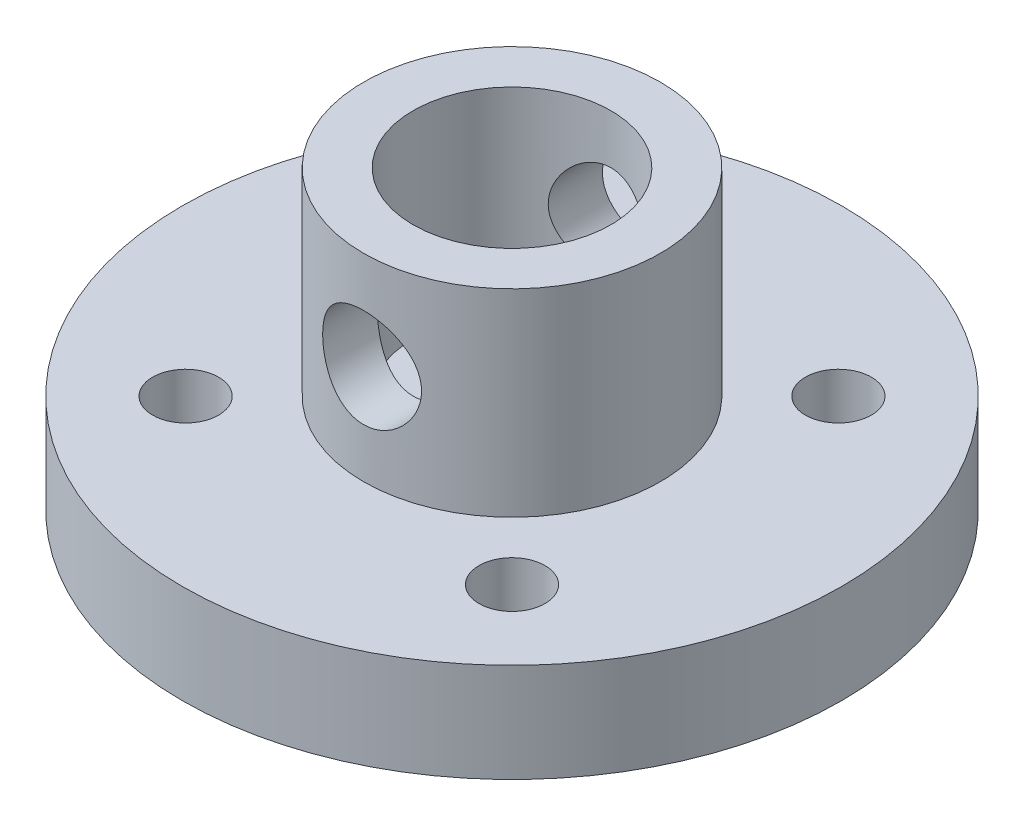
ISO-10303-21;
HEADER;
FILE_DESCRIPTION(('STEP AP214'),'2;1');
FILE_NAME('part.step','',(''),(''),'','','');
FILE_SCHEMA(('AUTOMOTIVE_DESIGN { 1 0 10303 214 1 1 1 1 }'));
ENDSEC;
DATA;
#1=APPLICATION_CONTEXT('core data for automotive mechanical design processes');
#2=APPLICATION_PROTOCOL_DEFINITION('international standard','automotive_design',2000,#1);
#3=PRODUCT_CONTEXT('',#1,'mechanical');
#4=PRODUCT('Part','Part','',(#3));
#5=PRODUCT_RELATED_PRODUCT_CATEGORY('part','',(#4));
#6=PRODUCT_DEFINITION_FORMATION('','',#4);
#7=PRODUCT_DEFINITION_CONTEXT('part definition',#1,'design');
#8=PRODUCT_DEFINITION('design','',#6,#7);
#9=PRODUCT_DEFINITION_SHAPE('','',#8);
#10=(LENGTH_UNIT() NAMED_UNIT(*) SI_UNIT(.MILLI.,.METRE.));
#11=(NAMED_UNIT(*) PLANE_ANGLE_UNIT() SI_UNIT($,.RADIAN.));
#12=(NAMED_UNIT(*) SI_UNIT($,.STERADIAN.) SOLID_ANGLE_UNIT());
#13=UNCERTAINTY_MEASURE_WITH_UNIT(LENGTH_MEASURE(1.E-05),#10,'distance_accuracy_value','');
#14=(GEOMETRIC_REPRESENTATION_CONTEXT(3) GLOBAL_UNCERTAINTY_ASSIGNED_CONTEXT((#13)) GLOBAL_UNIT_ASSIGNED_CONTEXT((#10,
#11,#12)) REPRESENTATION_CONTEXT('',''));
#15=CARTESIAN_POINT('',(0.,0.,0.));
#16=DIRECTION('',(0.,0.,1.));
#17=DIRECTION('',(1.,0.,0.));
#18=AXIS2_PLACEMENT_3D('',#15,#16,#17);
#19=CARTESIAN_POINT('',(-4.94974746830584,3.,-4.94974746830582));
#20=DIRECTION('',(0.,-1.,0.));
#21=DIRECTION('',(0.,0.,-1.));
#22=AXIS2_PLACEMENT_3D('',#19,#20,#21);
#23=CYLINDRICAL_SURFACE('',#22,1.);
#24=CARTESIAN_POINT('',(-4.94974746830584,3.,-4.94974746830582));
#25=DIRECTION('',(0.,1.,0.));
#26=DIRECTION('',(0.,0.,1.));
#27=AXIS2_PLACEMENT_3D('',#24,#25,#26);
#28=CIRCLE('',#27,1.);
#29=CARTESIAN_POINT('',(-4.94974746830584,3.,-3.94974746830582));
#30=VERTEX_POINT('',#29);
#31=EDGE_CURVE('E66',#30,#30,#28,.T.);
#32=ORIENTED_EDGE('',*,*,#31,.T.);
#33=EDGE_LOOP('',(#32));
#34=FACE_BOUND('',#33,.T.);
#35=CARTESIAN_POINT('',(-4.94974746830584,0.,-4.94974746830582));
#36=DIRECTION('',(0.,1.,0.));
#37=DIRECTION('',(0.,0.,1.));
#38=AXIS2_PLACEMENT_3D('',#35,#36,#37);
#39=CIRCLE('',#38,1.);
#40=CARTESIAN_POINT('',(-4.94974746830584,0.,-3.94974746830582));
#41=VERTEX_POINT('',#40);
#42=EDGE_CURVE('E102',#41,#41,#39,.T.);
#43=ORIENTED_EDGE('',*,*,#42,.F.);
#44=EDGE_LOOP('',(#43));
#45=FACE_BOUND('',#44,.T.);
#46=ADVANCED_FACE('F49',(#34,#45),#23,.F.);
#47=CARTESIAN_POINT('',(4.94974746830584,3.,-4.94974746830581));
#48=DIRECTION('',(0.,-1.,0.));
#49=DIRECTION('',(0.,0.,-1.));
#50=AXIS2_PLACEMENT_3D('',#47,#48,#49);
#51=CYLINDRICAL_SURFACE('',#50,1.);
#52=CARTESIAN_POINT('',(4.94974746830584,3.,-4.94974746830581));
#53=DIRECTION('',(0.,1.,0.));
#54=DIRECTION('',(0.,0.,1.));
#55=AXIS2_PLACEMENT_3D('',#52,#53,#54);
#56=CIRCLE('',#55,1.);
#57=CARTESIAN_POINT('',(4.94974746830584,3.,-3.94974746830581));
#58=VERTEX_POINT('',#57);
#59=EDGE_CURVE('E81',#58,#58,#56,.T.);
#60=ORIENTED_EDGE('',*,*,#59,.T.);
#61=EDGE_LOOP('',(#60));
#62=FACE_BOUND('',#61,.T.);
#63=CARTESIAN_POINT('',(4.94974746830584,0.,-4.94974746830581));
#64=DIRECTION('',(0.,1.,0.));
#65=DIRECTION('',(0.,0.,1.));
#66=AXIS2_PLACEMENT_3D('',#63,#64,#65);
#67=CIRCLE('',#66,1.);
#68=CARTESIAN_POINT('',(4.94974746830584,0.,-3.94974746830581));
#69=VERTEX_POINT('',#68);
#70=EDGE_CURVE('E99',#69,#69,#67,.T.);
#71=ORIENTED_EDGE('',*,*,#70,.F.);
#72=EDGE_LOOP('',(#71));
#73=FACE_BOUND('',#72,.T.);
#74=ADVANCED_FACE('F162',(#62,#73),#51,.F.);
#75=CARTESIAN_POINT('',(4.94974746830582,3.,4.94974746830587));
#76=DIRECTION('',(0.,-1.,0.));
#77=DIRECTION('',(0.,0.,-1.));
#78=AXIS2_PLACEMENT_3D('',#75,#76,#77);
#79=CYLINDRICAL_SURFACE('',#78,1.);
#80=CARTESIAN_POINT('',(4.94974746830582,3.,4.94974746830587));
#81=DIRECTION('',(0.,1.,0.));
#82=DIRECTION('',(0.,0.,1.));
#83=AXIS2_PLACEMENT_3D('',#80,#81,#82);
#84=CIRCLE('',#83,1.);
#85=CARTESIAN_POINT('',(4.94974746830582,3.,5.94974746830587));
#86=VERTEX_POINT('',#85);
#87=EDGE_CURVE('E76',#86,#86,#84,.T.);
#88=ORIENTED_EDGE('',*,*,#87,.T.);
#89=EDGE_LOOP('',(#88));
#90=FACE_BOUND('',#89,.T.);
#91=CARTESIAN_POINT('',(4.94974746830582,0.,4.94974746830587));
#92=DIRECTION('',(0.,1.,0.));
#93=DIRECTION('',(0.,0.,1.));
#94=AXIS2_PLACEMENT_3D('',#91,#92,#93);
#95=CIRCLE('',#94,1.);
#96=CARTESIAN_POINT('',(4.94974746830582,0.,5.94974746830587));
#97=VERTEX_POINT('',#96);
#98=EDGE_CURVE('E96',#97,#97,#95,.T.);
#99=ORIENTED_EDGE('',*,*,#98,.F.);
#100=EDGE_LOOP('',(#99));
#101=FACE_BOUND('',#100,.T.);
#102=ADVANCED_FACE('F167',(#90,#101),#79,.F.);
#103=CARTESIAN_POINT('',(-4.94974746830585,3.,4.94974746830587));
#104=DIRECTION('',(0.,-1.,0.));
#105=DIRECTION('',(0.,0.,-1.));
#106=AXIS2_PLACEMENT_3D('',#103,#104,#105);
#107=CYLINDRICAL_SURFACE('',#106,1.);
#108=CARTESIAN_POINT('',(-4.94974746830585,3.,4.94974746830587));
#109=DIRECTION('',(0.,1.,0.));
#110=DIRECTION('',(0.,0.,1.));
#111=AXIS2_PLACEMENT_3D('',#108,#109,#110);
#112=CIRCLE('',#111,1.);
#113=CARTESIAN_POINT('',(-4.94974746830585,3.,5.94974746830587));
#114=VERTEX_POINT('',#113);
#115=EDGE_CURVE('E77',#114,#114,#112,.T.);
#116=ORIENTED_EDGE('',*,*,#115,.T.);
#117=EDGE_LOOP('',(#116));
#118=FACE_BOUND('',#117,.T.);
#119=CARTESIAN_POINT('',(-4.94974746830585,0.,4.94974746830587));
#120=DIRECTION('',(0.,1.,0.));
#121=DIRECTION('',(0.,0.,1.));
#122=AXIS2_PLACEMENT_3D('',#119,#120,#121);
#123=CIRCLE('',#122,1.);
#124=CARTESIAN_POINT('',(-4.94974746830585,0.,5.94974746830587));
#125=VERTEX_POINT('',#124);
#126=EDGE_CURVE('E95',#125,#125,#123,.T.);
#127=ORIENTED_EDGE('',*,*,#126,.F.);
#128=EDGE_LOOP('',(#127));
#129=FACE_BOUND('',#128,.T.);
#130=ADVANCED_FACE('F55',(#118,#129),#107,.F.);
#131=CARTESIAN_POINT('',(0.,3.,0.));
#132=DIRECTION('',(0.,-1.,0.));
#133=DIRECTION('',(0.,0.,-1.));
#134=AXIS2_PLACEMENT_3D('',#131,#132,#133);
#135=CYLINDRICAL_SURFACE('',#134,10.);
#136=CARTESIAN_POINT('',(0.,3.,0.));
#137=DIRECTION('',(0.,1.,0.));
#138=DIRECTION('',(0.,0.,1.));
#139=AXIS2_PLACEMENT_3D('',#136,#137,#138);
#140=CIRCLE('',#139,10.);
#141=CARTESIAN_POINT('',(0.,3.,10.));
#142=VERTEX_POINT('',#141);
#143=EDGE_CURVE('E64',#142,#142,#140,.T.);
#144=ORIENTED_EDGE('',*,*,#143,.F.);
#145=EDGE_LOOP('',(#144));
#146=FACE_BOUND('',#145,.T.);
#147=CARTESIAN_POINT('',(0.,0.,0.));
#148=DIRECTION('',(0.,1.,0.));
#149=DIRECTION('',(0.,0.,1.));
#150=AXIS2_PLACEMENT_3D('',#147,#148,#149);
#151=CIRCLE('',#150,10.);
#152=CARTESIAN_POINT('',(0.,0.,10.));
#153=VERTEX_POINT('',#152);
#154=EDGE_CURVE('E82',#153,#153,#151,.T.);
#155=ORIENTED_EDGE('',*,*,#154,.T.);
#156=EDGE_LOOP('',(#155));
#157=FACE_BOUND('',#156,.T.);
#158=ADVANCED_FACE('F155',(#146,#157),#135,.T.);
#159=CARTESIAN_POINT('',(0.,3.,0.));
#160=DIRECTION('',(0.,1.,0.));
#161=DIRECTION('',(0.,0.,1.));
#162=AXIS2_PLACEMENT_3D('',#159,#160,#161);
#163=PLANE('',#162);
#164=CARTESIAN_POINT('',(0.,3.,0.));
#165=DIRECTION('',(0.,1.,0.));
#166=DIRECTION('',(0.,0.,1.));
#167=AXIS2_PLACEMENT_3D('',#164,#165,#166);
#168=CIRCLE('',#167,4.5);
#169=CARTESIAN_POINT('',(0.,3.,4.5));
#170=VERTEX_POINT('',#169);
#171=EDGE_CURVE('E11',#170,#170,#168,.T.);
#172=ORIENTED_EDGE('',*,*,#171,.F.);
#173=EDGE_LOOP('',(#172));
#174=FACE_BOUND('',#173,.T.);
#175=ORIENTED_EDGE('',*,*,#115,.F.);
#176=EDGE_LOOP('',(#175));
#177=FACE_BOUND('',#176,.T.);
#178=ORIENTED_EDGE('',*,*,#87,.F.);
#179=EDGE_LOOP('',(#178));
#180=FACE_BOUND('',#179,.T.);
#181=ORIENTED_EDGE('',*,*,#59,.F.);
#182=EDGE_LOOP('',(#181));
#183=FACE_BOUND('',#182,.T.);
#184=ORIENTED_EDGE('',*,*,#31,.F.);
#185=EDGE_LOOP('',(#184));
#186=FACE_BOUND('',#185,.T.);
#187=ORIENTED_EDGE('',*,*,#143,.T.);
#188=EDGE_LOOP('',(#187));
#189=FACE_BOUND('',#188,.T.);
#190=ADVANCED_FACE('F150',(#174,#177,#180,#183,#186,#189),#163,.T.);
#191=CARTESIAN_POINT('',(0.,0.,0.));
#192=DIRECTION('',(0.,1.,0.));
#193=DIRECTION('',(0.,0.,1.));
#194=AXIS2_PLACEMENT_3D('',#191,#192,#193);
#195=PLANE('',#194);
#196=ORIENTED_EDGE('',*,*,#126,.T.);
#197=EDGE_LOOP('',(#196));
#198=FACE_BOUND('',#197,.T.);
#199=ORIENTED_EDGE('',*,*,#98,.T.);
#200=EDGE_LOOP('',(#199));
#201=FACE_BOUND('',#200,.T.);
#202=ORIENTED_EDGE('',*,*,#70,.T.);
#203=EDGE_LOOP('',(#202));
#204=FACE_BOUND('',#203,.T.);
#205=ORIENTED_EDGE('',*,*,#42,.T.);
#206=EDGE_LOOP('',(#205));
#207=FACE_BOUND('',#206,.T.);
#208=ORIENTED_EDGE('',*,*,#154,.F.);
#209=EDGE_LOOP('',(#208));
#210=FACE_BOUND('',#209,.T.);
#211=ADVANCED_FACE('F151',(#198,#201,#204,#207,#210),#195,.F.);
#212=CARTESIAN_POINT('',(0.,9.,0.));
#213=DIRECTION('',(0.,1.,0.));
#214=DIRECTION('',(0.,0.,1.));
#215=AXIS2_PLACEMENT_3D('',#212,#213,#214);
#216=PLANE('',#215);
#217=CARTESIAN_POINT('',(0.,9.,0.));
#218=DIRECTION('',(0.,1.,0.));
#219=DIRECTION('',(0.,0.,1.));
#220=AXIS2_PLACEMENT_3D('',#217,#218,#219);
#221=CIRCLE('',#220,4.5);
#222=CARTESIAN_POINT('',(0.,9.,4.5));
#223=VERTEX_POINT('',#222);
#224=EDGE_CURVE('E74',#223,#223,#221,.T.);
#225=ORIENTED_EDGE('',*,*,#224,.T.);
#226=EDGE_LOOP('',(#225));
#227=FACE_BOUND('',#226,.T.);
#228=CARTESIAN_POINT('',(0.,9.,0.));
#229=DIRECTION('',(0.,1.,0.));
#230=DIRECTION('',(0.,0.,1.));
#231=AXIS2_PLACEMENT_3D('',#228,#229,#230);
#232=CIRCLE('',#231,3.);
#233=CARTESIAN_POINT('',(0.,9.,3.));
#234=VERTEX_POINT('',#233);
#235=EDGE_CURVE('E268',#234,#234,#232,.T.);
#236=ORIENTED_EDGE('',*,*,#235,.F.);
#237=EDGE_LOOP('',(#236));
#238=FACE_BOUND('',#237,.T.);
#239=ADVANCED_FACE('F144',(#227,#238),#216,.T.);
#240=CARTESIAN_POINT('',(0.,9.,0.));
#241=DIRECTION('',(0.,-1.,0.));
#242=DIRECTION('',(0.,0.,-1.));
#243=AXIS2_PLACEMENT_3D('',#240,#241,#242);
#244=CYLINDRICAL_SURFACE('',#243,4.5);
#245=CARTESIAN_POINT('',(0.,7.5,-4.5));
#246=CARTESIAN_POINT('',(-0.0818450443300849,7.50000038059746,-4.50000022951416));
#247=CARTESIAN_POINT('',(-0.163687791807825,7.49327960080918,-4.49774654261317));
#248=CARTESIAN_POINT('',(-0.324962641309459,7.46665633677417,-4.48897815304921));
#249=CARTESIAN_POINT('',(-0.404394492178227,7.44675248407662,-4.48246300803229));
#250=CARTESIAN_POINT('',(-0.558499184252664,7.39452113492393,-4.46587961859664));
#251=CARTESIAN_POINT('',(-0.633179738829052,7.36221440631109,-4.4558173159628));
#252=CARTESIAN_POINT('',(-0.776062405207987,7.28618824074248,-4.43316668576013));
#253=CARTESIAN_POINT('',(-0.844263235438059,7.2424665524961,-4.42057786001667));
#254=CARTESIAN_POINT('',(-0.9746125125334,7.14326129271187,-4.39371141664507));
#255=CARTESIAN_POINT('',(-1.03650555044746,7.08745314860926,-4.37939334695677));
#256=CARTESIAN_POINT('',(-1.15024903905313,6.96634926794015,-4.35090472174682));
#257=CARTESIAN_POINT('',(-1.20209727823419,6.90105144760723,-4.33673419935823));
#258=CARTESIAN_POINT('',(-1.29573741334179,6.76052232720531,-4.30969998715911));
#259=CARTESIAN_POINT('',(-1.33719728733155,6.68505939040182,-4.29688558913532));
#260=CARTESIAN_POINT('',(-1.40672831081658,6.52773585831218,-4.27462958127902));
#261=CARTESIAN_POINT('',(-1.43480354608015,6.44587722425588,-4.26518694241118));
#262=CARTESIAN_POINT('',(-1.47581019226375,6.28099016775494,-4.25116954904066));
#263=CARTESIAN_POINT('',(-1.48922017240765,6.1980941872664,-4.24644143654417));
#264=CARTESIAN_POINT('',(-1.50201168500172,6.03110436876618,-4.24193484944261));
#265=CARTESIAN_POINT('',(-1.50139755240708,5.94701090893622,-4.24215484534095));
#266=CARTESIAN_POINT('',(-1.48652985555513,5.78409505433397,-4.2473852251227));
#267=CARTESIAN_POINT('',(-1.47290086975049,5.70520739562147,-4.25217623801299));
#268=CARTESIAN_POINT('',(-1.43340924427413,5.55090987058975,-4.26564986586826));
#269=CARTESIAN_POINT('',(-1.40754513988781,5.47550042184739,-4.27433294676161));
#270=CARTESIAN_POINT('',(-1.34390858709032,5.32888087561278,-4.29476866696873));
#271=CARTESIAN_POINT('',(-1.30595107306089,5.25775796179571,-4.30656848689676));
#272=CARTESIAN_POINT('',(-1.21933365945471,5.12269363758041,-4.3318883786359));
#273=CARTESIAN_POINT('',(-1.17067066854601,5.05875430959993,-4.34540894685695));
#274=CARTESIAN_POINT('',(-1.06102399902336,4.93636260275884,-4.37350993751611));
#275=CARTESIAN_POINT('',(-0.999529725114467,4.8783709582364,-4.38810884032264));
#276=CARTESIAN_POINT('',(-0.867509354955096,4.7734031000049,-4.41610407580555));
#277=CARTESIAN_POINT('',(-0.796982393491221,4.72642794275326,-4.42950029307101));
#278=CARTESIAN_POINT('',(-0.647921419569401,4.6444555496474,-4.4537566190669));
#279=CARTESIAN_POINT('',(-0.569314914624505,4.6095817629889,-4.46459025012059));
#280=CARTESIAN_POINT('',(-0.406903625046761,4.55369523906643,-4.48230850716652));
#281=CARTESIAN_POINT('',(-0.32310065723243,4.53267768686485,-4.48919450482319));
#282=CARTESIAN_POINT('',(-0.156575744293956,4.50591650096646,-4.49801440607161));
#283=CARTESIAN_POINT('',(-0.073964399797269,4.49955028624087,-4.50015002750592));
#284=CARTESIAN_POINT('',(0.0911626049403564,4.5004990103977,-4.49983354042241));
#285=CARTESIAN_POINT('',(0.173678278979476,4.50781163996982,-4.49738220629043));
#286=CARTESIAN_POINT('',(0.333779799456384,4.53541786160394,-4.48830037075656));
#287=CARTESIAN_POINT('',(0.411439210252265,4.55532930907424,-4.48179298066788));
#288=CARTESIAN_POINT('',(0.56228393786936,4.60709016670009,-4.46537770245105));
#289=CARTESIAN_POINT('',(0.63546868276291,4.63894109920168,-4.45546938070013));
#290=CARTESIAN_POINT('',(0.77743244458991,4.71460564776118,-4.43293396930935));
#291=CARTESIAN_POINT('',(0.846044938825721,4.75871188992476,-4.42024222133679));
#292=CARTESIAN_POINT('',(0.975097245203381,4.85729122502023,-4.39357880874394));
#293=CARTESIAN_POINT('',(1.03553455169337,4.91176748404765,-4.37960675390741));
#294=CARTESIAN_POINT('',(1.14937876170945,5.03246812650988,-4.35115271970667));
#295=CARTESIAN_POINT('',(1.20234145386866,5.09911384039029,-4.33667641631142));
#296=CARTESIAN_POINT('',(1.29638628348536,5.24065735171633,-4.30949959942063));
#297=CARTESIAN_POINT('',(1.33746832189652,5.31555521795112,-4.29679910073003));
#298=CARTESIAN_POINT('',(1.40639539562454,5.47150952293485,-4.27473587687075));
#299=CARTESIAN_POINT('',(1.43426719824753,5.55255311875315,-4.26536641189468));
#300=CARTESIAN_POINT('',(1.47584200013903,5.7185679750662,-4.25116248459674));
#301=CARTESIAN_POINT('',(1.48955138243091,5.80353744810653,-4.24632597935459));
#302=CARTESIAN_POINT('',(1.50191442371601,5.97029564406138,-4.24196788311266));
#303=CARTESIAN_POINT('',(1.5013053859626,6.05202351043024,-4.24218600386123));
#304=CARTESIAN_POINT('',(1.48686344017304,6.21414761238309,-4.24726904735801));
#305=CARTESIAN_POINT('',(1.47303131918788,6.29454392693263,-4.25213369354042));
#306=CARTESIAN_POINT('',(1.43305771969402,6.45020349450371,-4.26576786457337));
#307=CARTESIAN_POINT('',(1.40715501902327,6.52553523750675,-4.27446147033716));
#308=CARTESIAN_POINT('',(1.34396904863962,6.6708411104074,-4.29474598227703));
#309=CARTESIAN_POINT('',(1.30668325283071,6.74081404678201,-4.3063375314509));
#310=CARTESIAN_POINT('',(1.21989103887514,6.87672550488437,-4.33174243839069));
#311=CARTESIAN_POINT('',(1.16992236414687,6.94235475284758,-4.34563067463206));
#312=CARTESIAN_POINT('',(1.05996432470347,7.0645347200763,-4.37375034424879));
#313=CARTESIAN_POINT('',(0.999972126677222,7.12108286353211,-4.38798187368559));
#314=CARTESIAN_POINT('',(0.868862335381032,7.22571661843377,-4.41585045788316));
#315=CARTESIAN_POINT('',(0.797402270249593,7.2733865216265,-4.42944272701885));
#316=CARTESIAN_POINT('',(0.647036036109937,7.35598564327597,-4.45388986758918));
#317=CARTESIAN_POINT('',(0.568131777198522,7.39091811888306,-4.46474543861895));
#318=CARTESIAN_POINT('',(0.408740470801464,7.44558244873301,-4.48208272602813));
#319=CARTESIAN_POINT('',(0.328481636514613,7.46592369939507,-4.48873818633784));
#320=CARTESIAN_POINT('',(0.165480624015371,7.49313042101569,-4.49769610596333));
#321=CARTESIAN_POINT('',(0.0827391383531199,7.49999961524481,-4.49999976797857));
#322=CARTESIAN_POINT('',(0.,7.5,-4.5));
#323=B_SPLINE_CURVE_WITH_KNOTS('',3,(#245,#246,#247,#248,#249,#250,#251,#252,#253,#254,#255,
#256,#257,#258,#259,#260,#261,#262,#263,#264,#265,#266,#267,#268,#269,#270,#271,#272,#273,#274,
#275,#276,#277,#278,#279,#280,#281,#282,#283,#284,#285,#286,#287,#288,#289,#290,#291,#292,#293,
#294,#295,#296,#297,#298,#299,#300,#301,#302,#303,#304,#305,#306,#307,#308,#309,#310,#311,#312,
#313,#314,#315,#316,#317,#318,#319,#320,#321,#322),.UNSPECIFIED.,.T.,.F.,(4,2,2,2,2,2,2,2,2,2,2,
2,2,2,2,2,2,2,2,2,2,2,2,2,2,2,2,2,2,2,2,2,2,2,2,2,2,2,4),(0.,0.245230659039017,
0.490486777901281,0.735334009305411,0.98022956669865,1.23277026424134,1.48536649931295,
1.74522577235206,2.0050056703925,2.2560288861276,2.50697450981228,2.7464523982692,
2.98595896283223,3.22932256732696,3.47275653837311,3.7288995871705,3.98506718949928,
4.24377608475536,4.50239503315813,4.74980374762755,4.99717069746265,5.2373723696732,
5.47760467926156,5.72415599765605,5.97078271232837,6.22861534321128,6.48645012352495,
6.74376020740156,7.0009542705876,7.24493499096388,7.48890119027063,7.72823380620626,
7.96761957263966,8.21745100037707,8.46735316685668,8.72699491252651,8.98657021728685,
9.23454837560721,9.4824579905721),.UNSPECIFIED.);
#324=CARTESIAN_POINT('',(0.,7.5,-4.5));
#325=VERTEX_POINT('',#324);
#326=EDGE_CURVE('E137',#325,#325,#323,.T.);
#327=ORIENTED_EDGE('',*,*,#326,.T.);
#328=EDGE_LOOP('',(#327));
#329=FACE_BOUND('',#328,.T.);
#330=CARTESIAN_POINT('',(1.5,6.,4.24264068711928));
#331=CARTESIAN_POINT('',(1.50000038692157,5.91829773774589,4.24264041795651));
#332=CARTESIAN_POINT('',(1.49330217552828,5.83659780026461,4.24502653936286));
#333=CARTESIAN_POINT('',(1.46677669753321,5.67561836850863,4.25426361121882));
#334=CARTESIAN_POINT('',(1.4469472682526,5.5963392751913,4.26111529713283));
#335=CARTESIAN_POINT('',(1.39493322852736,5.44255966050407,4.27842305533187));
#336=CARTESIAN_POINT('',(1.36277283210487,5.36805010583593,4.28887205956983));
#337=CARTESIAN_POINT('',(1.28709244266207,5.22545992717806,4.31218683015487));
#338=CARTESIAN_POINT('',(1.24356994329027,5.15738072616955,4.32505312955418));
#339=CARTESIAN_POINT('',(1.14457671966432,5.02692005649253,4.3523173411121));
#340=CARTESIAN_POINT('',(1.08873651206688,4.96482685699241,4.36675342266966));
#341=CARTESIAN_POINT('',(0.967481500821592,4.85068979816304,4.39520797201504));
#342=CARTESIAN_POINT('',(0.902065162578563,4.79864755262645,4.40922637243442));
#343=CARTESIAN_POINT('',(0.761406761947514,4.70478165400561,4.43570800382698));
#344=CARTESIAN_POINT('',(0.685952866836787,4.66326004407306,4.44812111552408));
#345=CARTESIAN_POINT('',(0.52864683448121,4.59361262230874,4.46954380156474));
#346=CARTESIAN_POINT('',(0.446796428530818,4.56548320023464,4.47855429304502));
#347=CARTESIAN_POINT('',(0.28204322615024,4.52439621805141,4.49188613147861));
#348=CARTESIAN_POINT('',(0.199276132279451,4.51094483061449,4.49635972166341));
#349=CARTESIAN_POINT('',(0.0325468122361348,4.49802555995901,4.5006541232737));
#350=CARTESIAN_POINT('',(-0.0514151003158404,4.49855407252137,4.50047613394335));
#351=CARTESIAN_POINT('',(-0.214655272790727,4.51326638184905,4.49559059428104));
#352=CARTESIAN_POINT('',(-0.293988072887501,4.52691379271176,4.49106097132703));
#353=CARTESIAN_POINT('',(-0.449165158233241,4.56658947147068,4.4782045100957));
#354=CARTESIAN_POINT('',(-0.525009206668763,4.59261857846963,4.46987741446672));
#355=CARTESIAN_POINT('',(-0.672228712263021,4.6566319759592,4.45013505439938));
#356=CARTESIAN_POINT('',(-0.743532331453497,4.69476890782017,4.43868063786404));
#357=CARTESIAN_POINT('',(-0.878886488290754,4.78178955817259,4.41387589557997));
#358=CARTESIAN_POINT('',(-0.942935001577155,4.83067626498996,4.40052504300777));
#359=CARTESIAN_POINT('',(-1.06515129982786,4.94051159019111,4.37259287776335));
#360=CARTESIAN_POINT('',(-1.12290023560133,5.00191973676816,4.35798322759));
#361=CARTESIAN_POINT('',(-1.22741588939383,5.13367308858399,4.32971002867667));
#362=CARTESIAN_POINT('',(-1.27418091490951,5.20401966856986,4.31604662597175));
#363=CARTESIAN_POINT('',(-1.3559811825641,5.35298043842312,4.29105787703296));
#364=CARTESIAN_POINT('',(-1.39083969547657,5.43169819705172,4.27976864008232));
#365=CARTESIAN_POINT('',(-1.44666478994926,5.59435709139939,4.26122476317448));
#366=CARTESIAN_POINT('',(-1.46763719363329,5.67829602183274,4.25396843251835));
#367=CARTESIAN_POINT('',(-1.49424192313571,5.84495753310093,4.24469454453105));
#368=CARTESIAN_POINT('',(-1.50052364325862,5.92756413711859,4.24245540472709));
#369=CARTESIAN_POINT('',(-1.49940815836741,6.09266422367556,4.24285008094201));
#370=CARTESIAN_POINT('',(-1.49201343784089,6.17515772403714,4.24548301189152));
#371=CARTESIAN_POINT('',(-1.46433847732775,6.33473544856675,4.25510427134068));
#372=CARTESIAN_POINT('',(-1.44450959097083,6.41190814522596,4.2619398816089));
#373=CARTESIAN_POINT('',(-1.39307079384089,6.56181540935908,4.27902830506905));
#374=CARTESIAN_POINT('',(-1.36145879454519,6.63454918738625,4.2892817240236));
#375=CARTESIAN_POINT('',(-1.28621151110835,6.77607063127041,4.31245316393576));
#376=CARTESIAN_POINT('',(-1.24222667753773,6.84465996396268,4.32544538498415));
#377=CARTESIAN_POINT('',(-1.14387844583635,6.9737190785756,4.35248653096476));
#378=CARTESIAN_POINT('',(-1.08951198824818,7.03418645799184,4.36653576665699));
#379=CARTESIAN_POINT('',(-0.968837558850484,7.14829197613595,4.39492557956765));
#380=CARTESIAN_POINT('',(-0.902080905819977,7.20146158502827,4.40924765366843));
#381=CARTESIAN_POINT('',(-0.760240937100387,7.29587421352207,4.43590277419665));
#382=CARTESIAN_POINT('',(-0.68515791729683,7.33711765674364,4.44823589126543));
#383=CARTESIAN_POINT('',(-0.529169793648445,7.40613015729257,4.46946608715904));
#384=CARTESIAN_POINT('',(-0.448306684981796,7.4339869157221,4.47838545006796));
#385=CARTESIAN_POINT('',(-0.282687698769025,7.47559161309016,4.49187916256662));
#386=CARTESIAN_POINT('',(-0.197933237930835,7.48934464482076,4.49645508051028));
#387=CARTESIAN_POINT('',(-0.0312230037900621,7.50189311640847,4.50062794854384));
#388=CARTESIAN_POINT('',(0.0506770858800273,7.50136118089857,4.50044880134159));
#389=CARTESIAN_POINT('',(0.213166717500261,7.48701403778039,4.49568294779097));
#390=CARTESIAN_POINT('',(0.293756365228585,7.47319990777085,4.49109659900364));
#391=CARTESIAN_POINT('',(0.450063179148088,7.43312664813606,4.47811372431618));
#392=CARTESIAN_POINT('',(0.525837406369183,7.4070686769706,4.46977887541723));
#393=CARTESIAN_POINT('',(0.671967526409693,7.34343370335427,4.45015741056742));
#394=CARTESIAN_POINT('',(0.742322436213648,7.30585461720448,4.43887026072025));
#395=CARTESIAN_POINT('',(0.878451024463178,7.21864573184699,4.41398803241821));
#396=CARTESIAN_POINT('',(0.94395937733641,7.16862197192754,4.4003230873789));
#397=CARTESIAN_POINT('',(1.06587153940864,7.05861391326571,4.37239483187819));
#398=CARTESIAN_POINT('',(1.12227243243689,6.99862643660591,4.35813133159646));
#399=CARTESIAN_POINT('',(1.22661271324968,6.86758596661958,4.32994919738397));
#400=CARTESIAN_POINT('',(1.27413444899685,6.79619173353504,4.31606591982946));
#401=CARTESIAN_POINT('',(1.35647151495167,6.64599835964583,4.29090289984523));
#402=CARTESIAN_POINT('',(1.39129016522921,6.5672011604555,4.27962247741874));
#403=CARTESIAN_POINT('',(1.44576574230625,6.40805726397655,4.26152001309772));
#404=CARTESIAN_POINT('',(1.46603686372428,6.32794160471195,4.25451949285773));
#405=CARTESIAN_POINT('',(1.4931514802239,6.16521592429995,4.24508075309277));
#406=CARTESIAN_POINT('',(1.49999960879489,6.08260677388394,4.24264095926192));
#407=CARTESIAN_POINT('',(1.5,6.,4.24264068711928));
#408=B_SPLINE_CURVE_WITH_KNOTS('',3,(#330,#331,#332,#333,#334,#335,#336,#337,#338,#339,#340,
#341,#342,#343,#344,#345,#346,#347,#348,#349,#350,#351,#352,#353,#354,#355,#356,#357,#358,#359,
#360,#361,#362,#363,#364,#365,#366,#367,#368,#369,#370,#371,#372,#373,#374,#375,#376,#377,#378,
#379,#380,#381,#382,#383,#384,#385,#386,#387,#388,#389,#390,#391,#392,#393,#394,#395,#396,#397,
#398,#399,#400,#401,#402,#403,#404,#405,#406,#407),.UNSPECIFIED.,.T.,.F.,(4,2,2,2,2,2,2,2,2,2,2,
2,2,2,2,2,2,2,2,2,2,2,2,2,2,2,2,2,2,2,2,2,2,2,2,2,2,2,4),(0.,0.244800877199034,
0.489642082522746,0.734004941251242,0.978421749278163,1.23152006141352,1.48465897757982,
1.74440259215486,2.00407614580184,2.25471478147402,2.50528879953491,2.74603507238354,
2.98679766283855,3.23072482290503,3.47471987811033,3.73020261545876,3.98572469418159,
4.24488959763007,4.50394577031475,4.75131437043211,4.99863803752402,5.23746593649716,
5.4763361871697,5.72278286600124,5.96930228489743,6.22768212253191,6.4860527813285,
6.74270686782829,6.99926824502787,7.24377127013005,7.48825446011223,7.72885434057197,
7.96949776141416,8.21903279277502,8.46864756645499,8.72803354100769,8.98735167396852,
9.23494818240588,9.48245920782248),.UNSPECIFIED.);
#409=CARTESIAN_POINT('',(1.5,6.,4.24264068711928));
#410=VERTEX_POINT('',#409);
#411=EDGE_CURVE('E129',#410,#410,#408,.T.);
#412=ORIENTED_EDGE('',*,*,#411,.T.);
#413=EDGE_LOOP('',(#412));
#414=FACE_BOUND('',#413,.T.);
#415=ORIENTED_EDGE('',*,*,#224,.F.);
#416=EDGE_LOOP('',(#415));
#417=FACE_BOUND('',#416,.T.);
#418=ORIENTED_EDGE('',*,*,#171,.T.);
#419=EDGE_LOOP('',(#418));
#420=FACE_BOUND('',#419,.T.);
#421=ADVANCED_FACE('F143',(#329,#414,#417,#420),#244,.T.);
#422=CARTESIAN_POINT('',(0.,9.,0.));
#423=DIRECTION('',(0.,-1.,0.));
#424=DIRECTION('',(0.,0.,-1.));
#425=AXIS2_PLACEMENT_3D('',#422,#423,#424);
#426=CYLINDRICAL_SURFACE('',#425,3.);
#427=CARTESIAN_POINT('',(0.,7.5,-3.));
#428=CARTESIAN_POINT('',(-0.0788579444268502,7.49999504652421,-2.99999570107562));
#429=CARTESIAN_POINT('',(-0.157809899546344,7.49374489031842,-2.99685736529635));
#430=CARTESIAN_POINT('',(-0.313380352903344,7.46902067948769,-2.98461234055736));
#431=CARTESIAN_POINT('',(-0.389994130070444,7.45052341050328,-2.97549431743379));
#432=CARTESIAN_POINT('',(-0.538400317320674,7.40220928707506,-2.95224419105063));
#433=CARTESIAN_POINT('',(-0.61021020440872,7.37243642362805,-2.93813158766306));
#434=CARTESIAN_POINT('',(-0.747708925209898,7.30264406795252,-2.90618664773642));
#435=CARTESIAN_POINT('',(-0.813398240985089,7.2626253836267,-2.88835460450288));
#436=CARTESIAN_POINT('',(-0.941261726642864,7.17072412577207,-2.84934387387093));
#437=CARTESIAN_POINT('',(-1.00298281668316,7.11827028114054,-2.82802798691306));
#438=CARTESIAN_POINT('',(-1.11716916730047,7.00421778112945,-2.78489955370115));
#439=CARTESIAN_POINT('',(-1.16962737466015,6.94261222234134,-2.76308664313552));
#440=CARTESIAN_POINT('',(-1.26787800067542,6.80627497571493,-2.71948426796021));
#441=CARTESIAN_POINT('',(-1.31283800332746,6.73089585248113,-2.69782780455198));
#442=CARTESIAN_POINT('',(-1.38925234033604,6.57244899602068,-2.65928968158481));
#443=CARTESIAN_POINT('',(-1.4207163224495,6.48938680691588,-2.64240461410484));
#444=CARTESIAN_POINT('',(-1.46719866328288,6.32300234186712,-2.61686800556713));
#445=CARTESIAN_POINT('',(-1.48308878562066,6.23999332189891,-2.6077840737557));
#446=CARTESIAN_POINT('',(-1.50064048996327,6.07203174333079,-2.59772834922792));
#447=CARTESIAN_POINT('',(-1.50231613255961,5.98708118869327,-2.59674854014932));
#448=CARTESIAN_POINT('',(-1.49203093075844,5.82857096352695,-2.60266395385873));
#449=CARTESIAN_POINT('',(-1.48167683930523,5.75486395316543,-2.6086314549302));
#450=CARTESIAN_POINT('',(-1.4504097735854,5.61041713594044,-2.62614343100775));
#451=CARTESIAN_POINT('',(-1.42949343584648,5.53967828204203,-2.63768968247664));
#452=CARTESIAN_POINT('',(-1.37731467057901,5.40115630115151,-2.66531214619112));
#453=CARTESIAN_POINT('',(-1.34582260067399,5.33348040182132,-2.68148760995998));
#454=CARTESIAN_POINT('',(-1.273562531502,5.20404856111499,-2.71655106422106));
#455=CARTESIAN_POINT('',(-1.2327903657187,5.14229529659987,-2.73544027170286));
#456=CARTESIAN_POINT('',(-1.13709908236918,5.01821812088516,-2.77669736854929));
#457=CARTESIAN_POINT('',(-1.08104168755392,4.95681468963577,-2.79920265355119));
#458=CARTESIAN_POINT('',(-0.959333368112061,4.84389687211365,-2.84321434950611));
#459=CARTESIAN_POINT('',(-0.893677884861428,4.79238721194918,-2.86472027938201));
#460=CARTESIAN_POINT('',(-0.750774758747773,4.69847150845541,-2.90552980924446));
#461=CARTESIAN_POINT('',(-0.673130387399113,4.65659929133139,-2.92468476243011));
#462=CARTESIAN_POINT('',(-0.510699323233195,4.58685445643549,-2.95736821681863));
#463=CARTESIAN_POINT('',(-0.425918364397914,4.55897072247725,-2.9709011841533));
#464=CARTESIAN_POINT('',(-0.259149737491053,4.52028689442499,-2.98986500612153));
#465=CARTESIAN_POINT('',(-0.177512295822489,4.50826314637983,-2.99587407451965));
#466=CARTESIAN_POINT('',(-0.0131693999240275,4.49780290329827,-3.00109520188655));
#467=CARTESIAN_POINT('',(0.069535529804863,4.4993599715408,-3.00031048081978));
#468=CARTESIAN_POINT('',(0.22684945797898,4.51531003262812,-2.99236788380152));
#469=CARTESIAN_POINT('',(0.301589112074895,4.52869879909499,-2.98570868532253));
#470=CARTESIAN_POINT('',(0.447610338452912,4.56635710784268,-2.9673325697226));
#471=CARTESIAN_POINT('',(0.51889152853663,4.59062784968024,-2.95561509501618));
#472=CARTESIAN_POINT('',(0.658332912674359,4.64999769964955,-2.92776377120382));
#473=CARTESIAN_POINT('',(0.726345595508705,4.68538657517443,-2.91151322654446));
#474=CARTESIAN_POINT('',(0.855692042548907,4.76566130346985,-2.87615961476126));
#475=CARTESIAN_POINT('',(0.917022944664887,4.81055120189309,-2.85705533350407));
#476=CARTESIAN_POINT('',(1.03765153393382,4.91364063799608,-2.81562332004297));
#477=CARTESIAN_POINT('',(1.09615811672854,4.97271430266772,-2.79316327265249));
#478=CARTESIAN_POINT('',(1.20278448167828,5.09988772691659,-2.7489358741323));
#479=CARTESIAN_POINT('',(1.25089707856781,5.16799367827188,-2.72716901100071));
#480=CARTESIAN_POINT('',(1.33756187171853,5.31546548125946,-2.68576788309734));
#481=CARTESIAN_POINT('',(1.37553824370037,5.39521689914172,-2.66628794383591));
#482=CARTESIAN_POINT('',(1.43712423890206,5.56126510136245,-2.63361108441202));
#483=CARTESIAN_POINT('',(1.46075237380052,5.64755328970034,-2.62040607332625));
#484=CARTESIAN_POINT('',(1.49079253120031,5.81536533432706,-2.60342251538703));
#485=CARTESIAN_POINT('',(1.49863949460818,5.89655138015286,-2.59886075197597));
#486=CARTESIAN_POINT('',(1.5010337315643,6.05917060074679,-2.59748031962405));
#487=CARTESIAN_POINT('',(1.49558676993486,6.14060365310679,-2.60065829439585));
#488=CARTESIAN_POINT('',(1.47288918838996,6.29322525230016,-2.61356793076615));
#489=CARTESIAN_POINT('',(1.45681247151455,6.36465070521711,-2.62264641723988));
#490=CARTESIAN_POINT('',(1.41476303733662,6.50371217913655,-2.64556524281479));
#491=CARTESIAN_POINT('',(1.38878713673988,6.57134697313805,-2.65940711354503));
#492=CARTESIAN_POINT('',(1.32572361795085,6.70593727647981,-2.69142795546804));
#493=CARTESIAN_POINT('',(1.28800670672355,6.77254185274354,-2.70983583593881));
#494=CARTESIAN_POINT('',(1.20322645745609,6.89891180427189,-2.74852997452291));
#495=CARTESIAN_POINT('',(1.15615825686234,6.95867359578167,-2.76881720693416));
#496=CARTESIAN_POINT('',(1.04730498999206,7.07721297353201,-2.81193484737138));
#497=CARTESIAN_POINT('',(0.984426634495892,7.13498865352544,-2.83477474959942));
#498=CARTESIAN_POINT('',(0.849232209349796,7.2393944751529,-2.87816628389896));
#499=CARTESIAN_POINT('',(0.776911084957796,7.28601860920486,-2.89871667939293));
#500=CARTESIAN_POINT('',(0.623897395174419,7.36685454406811,-2.93547014349806));
#501=CARTESIAN_POINT('',(0.543149255665096,7.4009762538547,-2.95164144740899));
#502=CARTESIAN_POINT('',(0.37611315170713,7.45471225163611,-2.9775201194848));
#503=CARTESIAN_POINT('',(0.28984169938365,7.47436777020857,-2.98724585044602));
#504=CARTESIAN_POINT('',(0.168902919736343,7.49084611662861,-2.99543192870217));
#505=CARTESIAN_POINT('',(0.135242819162347,7.49427396129951,-2.99714048010376));
#506=CARTESIAN_POINT('',(0.0677275977076369,7.49885199827113,-2.99942545465223));
#507=CARTESIAN_POINT('',(0.0338724714699424,7.50000212770531,-3.00000184655071));
#508=CARTESIAN_POINT('',(0.,7.5,-3.));
#509=B_SPLINE_CURVE_WITH_KNOTS('',3,(#427,#428,#429,#430,#431,#432,#433,#434,#435,#436,#437,
#438,#439,#440,#441,#442,#443,#444,#445,#446,#447,#448,#449,#450,#451,#452,#453,#454,#455,#456,
#457,#458,#459,#460,#461,#462,#463,#464,#465,#466,#467,#468,#469,#470,#471,#472,#473,#474,#475,
#476,#477,#478,#479,#480,#481,#482,#483,#484,#485,#486,#487,#488,#489,#490,#491,#492,#493,#494,
#495,#496,#497,#498,#499,#500,#501,#502,#503,#504,#505,#506,#507,#508),.UNSPECIFIED.,.T.,.F.,(4,
2,2,2,2,2,2,2,2,2,2,2,2,2,2,2,2,2,2,2,2,2,2,2,2,2,2,2,2,2,2,2,2,2,2,2,2,2,2,2,4),(0.,
0.236436386130439,0.473322224563796,0.709293233238448,0.945245640872351,1.19547263807713,
1.44588935648105,1.71572589646129,1.98536921847421,2.23887018210344,2.49212035993531,
2.71508568613981,2.93812205888518,3.16635360252731,3.39468781890333,3.65197412000818,
3.9093830189803,4.17874533321661,4.44789325368419,4.69474935707018,4.94148846767214,
5.16910359759183,5.39674382446397,5.63089284041848,5.86514176122509,6.12239415966628,
6.37982382923147,6.64972023242588,6.91926767918176,7.1629396125457,7.40650589797017,
7.62686895373283,7.84730293182526,8.08254685170431,8.31791341715446,8.58187864135757,
8.84598575071868,9.1119602049529,9.37717362931724,9.47872920200875,9.58028757766599),.UNSPECIFIED.);
#510=CARTESIAN_POINT('',(0.,7.5,-3.));
#511=VERTEX_POINT('',#510);
#512=EDGE_CURVE('E53',#511,#511,#509,.T.);
#513=ORIENTED_EDGE('',*,*,#512,.F.);
#514=EDGE_LOOP('',(#513));
#515=FACE_BOUND('',#514,.T.);
#516=CARTESIAN_POINT('',(1.5,6.,2.59807621135332));
#517=CARTESIAN_POINT('',(1.4999945446118,5.92183828770713,2.59808302092689));
#518=CARTESIAN_POINT('',(1.49384995609983,5.84357788271243,2.60165701781635));
#519=CARTESIAN_POINT('',(1.46958481484708,5.68945910298427,2.61543549678079));
#520=CARTESIAN_POINT('',(1.45143909683127,5.61360612743489,2.62565391083339));
#521=CARTESIAN_POINT('',(1.40414992304972,5.46682250348409,2.65124019908098));
#522=CARTESIAN_POINT('',(1.3750649287406,5.39586802128962,2.66658065209878));
#523=CARTESIAN_POINT('',(1.30690128806456,5.25986369700492,2.70063997225287));
#524=CARTESIAN_POINT('',(1.26782210105366,5.19481417460631,2.71935902214097));
#525=CARTESIAN_POINT('',(1.17699981079632,5.06654140716374,2.75995303586162));
#526=CARTESIAN_POINT('',(1.12447805421566,5.00391129648969,2.7819609545693));
#527=CARTESIAN_POINT('',(1.0098807114217,4.88788741738994,2.82557974178559));
#528=CARTESIAN_POINT('',(0.94780038867344,4.83449825612472,2.84719040746875));
#529=CARTESIAN_POINT('',(0.810734345121819,4.73494927327851,2.88932215429424));
#530=CARTESIAN_POINT('',(0.735160783518862,4.68951934821071,2.90967159627259));
#531=CARTESIAN_POINT('',(0.576235539899256,4.61228872013136,2.94526134149294));
#532=CARTESIAN_POINT('',(0.492888807207232,4.58047941579425,2.96050486775612));
#533=CARTESIAN_POINT('',(0.327067415888965,4.53374300804836,2.98320691866356));
#534=CARTESIAN_POINT('',(0.244952685733226,4.5177757104667,2.99114220331338));
#535=CARTESIAN_POINT('',(0.0788559430467717,4.49975082198744,3.00011375769101));
#536=CARTESIAN_POINT('',(-0.00512490876560822,4.49768481480644,3.00115420176885));
#537=CARTESIAN_POINT('',(-0.164748786635625,4.50712001095553,2.99644472874675));
#538=CARTESIAN_POINT('',(-0.240481798765188,4.51745702328183,2.99127743838241));
#539=CARTESIAN_POINT('',(-0.388970657877483,4.54932126585699,2.97561367889621));
#540=CARTESIAN_POINT('',(-0.461726281640889,4.57084933346434,2.96511681099591));
#541=CARTESIAN_POINT('',(-0.603464087354331,4.62462384913472,2.93957374931482));
#542=CARTESIAN_POINT('',(-0.672380135272768,4.6570144697581,2.92446662293799));
#543=CARTESIAN_POINT('',(-0.803965202269994,4.73139512430224,2.89106468980031));
#544=CARTESIAN_POINT('',(-0.866631973257969,4.77338859495353,2.87276874236226));
#545=CARTESIAN_POINT('',(-0.990260491347293,4.87034302729952,2.83266591598844));
#546=CARTESIAN_POINT('',(-1.05050111254404,4.92615454248902,2.81069063997263));
#547=CARTESIAN_POINT('',(-1.16115655544667,5.04688458739527,2.76681510880217));
#548=CARTESIAN_POINT('',(-1.21156381736135,5.11181005841109,2.74491492398443));
#549=CARTESIAN_POINT('',(-1.30425800196332,5.25397228863613,2.70216234138727));
#550=CARTESIAN_POINT('',(-1.34582597246708,5.33172903458132,2.68146479986061));
#551=CARTESIAN_POINT('',(-1.41497866950185,5.4944065070385,2.64563175417864));
#552=CARTESIAN_POINT('',(-1.44257798731633,5.57931964952635,2.63049045069101));
#553=CARTESIAN_POINT('',(-1.48077031653756,5.74682176692419,2.60916953725552));
#554=CARTESIAN_POINT('',(-1.49253768317996,5.82906167856533,2.60237483772745));
#555=CARTESIAN_POINT('',(-1.50227541991714,5.99460201227481,2.59676879042414));
#556=CARTESIAN_POINT('',(-1.50025553597254,6.07790164367968,2.59795180333967));
#557=CARTESIAN_POINT('',(-1.48355406501595,6.23348087786809,2.60751504810877));
#558=CARTESIAN_POINT('',(-1.4702817250687,6.30596917666189,2.61509381259981));
#559=CARTESIAN_POINT('',(-1.43354442694866,6.44755167940644,2.63541032327012));
#560=CARTESIAN_POINT('',(-1.41007616793542,6.51664477611992,2.64814974007551));
#561=CARTESIAN_POINT('',(-1.35247138290733,6.65311699635405,2.67804333119485));
#562=CARTESIAN_POINT('',(-1.31789109553908,6.72026852528033,2.69537464864595));
#563=CARTESIAN_POINT('',(-1.23943059602371,6.84820390730849,2.73234179245875));
#564=CARTESIAN_POINT('',(-1.19554560649832,6.90898446526993,2.75197880032721));
#565=CARTESIAN_POINT('',(-1.09325575079828,7.03046815128532,2.79431997684504));
#566=CARTESIAN_POINT('',(-1.03371790847245,7.09019572607649,2.81709874731434));
#567=CARTESIAN_POINT('',(-0.905106743097432,7.19911835699039,2.86101352466839));
#568=CARTESIAN_POINT('',(-0.836030211983019,7.24830985534581,2.88214897511564));
#569=CARTESIAN_POINT('',(-0.687803043838134,7.33586058892516,2.92112042536435));
#570=CARTESIAN_POINT('',(-0.608434646361168,7.37389967731637,2.93885462508044));
#571=CARTESIAN_POINT('',(-0.443283546961622,7.43570685578609,2.96825032438952));
#572=CARTESIAN_POINT('',(-0.357506552088262,7.45948747704946,2.9799171551456));
#573=CARTESIAN_POINT('',(-0.190469523495624,7.49005284626199,2.99501262272824));
#574=CARTESIAN_POINT('',(-0.109517165775684,7.49819681381417,2.99909891862287));
#575=CARTESIAN_POINT('',(0.0526889789268066,7.5012648981816,3.00063195562697));
#576=CARTESIAN_POINT('',(0.133942650442631,7.49619364278535,2.99808102100335));
#577=CARTESIAN_POINT('',(0.288806988475722,7.47387538980656,2.98700953256884));
#578=CARTESIAN_POINT('',(0.362568476716897,7.45745272611349,2.97889342001985));
#579=CARTESIAN_POINT('',(0.506168928275428,7.41400950104555,2.95788140495135));
#580=CARTESIAN_POINT('',(0.576007327433264,7.38698741985982,2.94498481699193));
#581=CARTESIAN_POINT('',(0.713135109367328,7.32190942175104,2.9148889612218));
#582=CARTESIAN_POINT('',(0.78018771405007,7.28343101518824,2.89752925798199));
#583=CARTESIAN_POINT('',(0.907161962721038,7.19706310371143,2.86032199712739));
#584=CARTESIAN_POINT('',(0.967080311122362,7.14916927632649,2.84047329837541));
#585=CARTESIAN_POINT('',(1.08437100623534,7.03980429146595,2.79792915339941));
#586=CARTESIAN_POINT('',(1.14089652680891,6.97745626878421,2.77514698517547));
#587=CARTESIAN_POINT('',(1.24299493109201,6.84382391830535,2.73094614244278));
#588=CARTESIAN_POINT('',(1.28855812501509,6.77253176869847,2.70952868642798));
#589=CARTESIAN_POINT('',(1.36864661967848,6.62004503012857,2.66999407957374));
#590=CARTESIAN_POINT('',(1.40277759894141,6.5386087033069,2.65200261384405));
#591=CARTESIAN_POINT('',(1.45631806425962,6.37000139349033,2.62299234492527));
#592=CARTESIAN_POINT('',(1.47577678676302,6.28285066663097,2.61195024221553));
#593=CARTESIAN_POINT('',(1.49155051179662,6.16229196652201,2.60293908902686));
#594=CARTESIAN_POINT('',(1.49471415744578,6.12994815840318,2.60112193507728));
#595=CARTESIAN_POINT('',(1.49894010763494,6.06507527897664,2.59868903831625));
#596=CARTESIAN_POINT('',(1.50000227159981,6.03254619542119,2.59807337587664));
#597=CARTESIAN_POINT('',(1.5,6.,2.59807621135332));
#598=B_SPLINE_CURVE_WITH_KNOTS('',3,(#516,#517,#518,#519,#520,#521,#522,#523,#524,#525,#526,
#527,#528,#529,#530,#531,#532,#533,#534,#535,#536,#537,#538,#539,#540,#541,#542,#543,#544,#545,
#546,#547,#548,#549,#550,#551,#552,#553,#554,#555,#556,#557,#558,#559,#560,#561,#562,#563,#564,
#565,#566,#567,#568,#569,#570,#571,#572,#573,#574,#575,#576,#577,#578,#579,#580,#581,#582,#583,
#584,#585,#586,#587,#588,#589,#590,#591,#592,#593,#594,#595,#596,#597),.UNSPECIFIED.,.T.,.F.,(4,
2,2,2,2,2,2,2,2,2,2,2,2,2,2,2,2,2,2,2,2,2,2,2,2,2,2,2,2,2,2,2,2,2,2,2,2,2,2,2,4),(0.,
0.234348183892072,0.469189339237207,0.702792893878329,0.936409088167725,1.18929346874735,
1.44230356626556,1.71236838358145,1.98226240445837,2.23295227451903,2.4834903552906,
2.71224146226808,2.94100968776183,3.1729430209672,3.40495949025408,3.65890787185336,
3.91305072368878,4.18333262594173,4.45333161317557,4.70193436281318,4.9503613978256,
5.17161275136038,5.39293578654095,5.62450944609132,5.85620229330071,6.1171011537092,
6.37808797467303,6.64596272119449,6.91360169713157,7.1566840558423,7.39968130190958,
7.62666637307239,7.8536840026802,8.09041126079208,8.32724745151079,8.58765362775101,
8.84828914267731,9.11716123557907,9.3851269950414,9.48270202777964,9.58028358741811),.UNSPECIFIED.);
#599=CARTESIAN_POINT('',(1.5,6.,2.59807621135332));
#600=VERTEX_POINT('',#599);
#601=EDGE_CURVE('E109',#600,#600,#598,.T.);
#602=ORIENTED_EDGE('',*,*,#601,.F.);
#603=EDGE_LOOP('',(#602));
#604=FACE_BOUND('',#603,.T.);
#605=ORIENTED_EDGE('',*,*,#235,.T.);
#606=EDGE_LOOP('',(#605));
#607=FACE_BOUND('',#606,.T.);
#608=CARTESIAN_POINT('',(0.,3.,0.));
#609=DIRECTION('',(0.,1.,0.));
#610=DIRECTION('',(0.,0.,1.));
#611=AXIS2_PLACEMENT_3D('',#608,#609,#610);
#612=CIRCLE('',#611,3.);
#613=CARTESIAN_POINT('',(0.,3.,3.));
#614=VERTEX_POINT('',#613);
#615=EDGE_CURVE('E271',#614,#614,#612,.T.);
#616=ORIENTED_EDGE('',*,*,#615,.F.);
#617=EDGE_LOOP('',(#616));
#618=FACE_BOUND('',#617,.T.);
#619=ADVANCED_FACE('F117',(#515,#604,#607,#618),#426,.F.);
#620=ORIENTED_EDGE('',*,*,#615,.T.);
#621=EDGE_LOOP('',(#620));
#622=FACE_BOUND('',#621,.T.);
#623=ADVANCED_FACE('F152',(#622),#163,.T.);
#624=CARTESIAN_POINT('',(0.,6.,-10.));
#625=DIRECTION('',(0.,0.,1.));
#626=DIRECTION('',(1.,0.,0.));
#627=AXIS2_PLACEMENT_3D('',#624,#625,#626);
#628=CYLINDRICAL_SURFACE('',#627,1.5);
#629=ORIENTED_EDGE('',*,*,#601,.T.);
#630=EDGE_LOOP('',(#629));
#631=FACE_BOUND('',#630,.T.);
#632=ORIENTED_EDGE('',*,*,#411,.F.);
#633=EDGE_LOOP('',(#632));
#634=FACE_BOUND('',#633,.T.);
#635=ADVANCED_FACE('F125',(#631,#634),#628,.F.);
#636=ORIENTED_EDGE('',*,*,#512,.T.);
#637=EDGE_LOOP('',(#636));
#638=FACE_BOUND('',#637,.T.);
#639=ORIENTED_EDGE('',*,*,#326,.F.);
#640=EDGE_LOOP('',(#639));
#641=FACE_BOUND('',#640,.T.);
#642=ADVANCED_FACE('F119',(#638,#641),#628,.F.);
#643=CLOSED_SHELL('',(#46,#74,#102,#130,#158,#190,#211,#239,#421,#619,#623,#635,#642));
#644=MANIFOLD_SOLID_BREP('B2',#643);
#645=ADVANCED_BREP_SHAPE_REPRESENTATION('',(#18,#644),#14);
#646=SHAPE_DEFINITION_REPRESENTATION(#9,#645);
ENDSEC;
END-ISO-10303-21;
